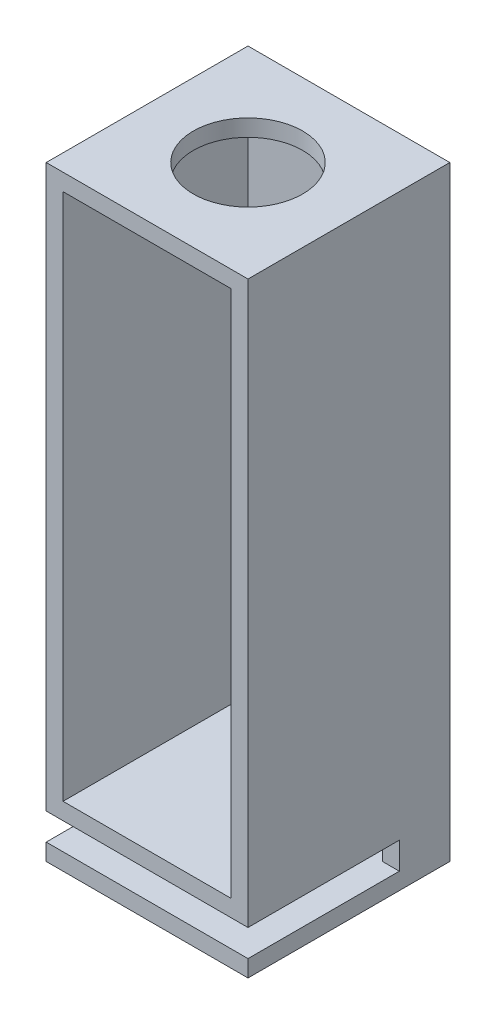
ISO-10303-21;
HEADER;
FILE_DESCRIPTION(('STEP AP214'),'2;1');
FILE_NAME('part.step','',(''),(''),'','','');
FILE_SCHEMA(('AUTOMOTIVE_DESIGN { 1 0 10303 214 1 1 1 1 }'));
ENDSEC;
DATA;
#1=APPLICATION_CONTEXT('core data for automotive mechanical design processes');
#2=APPLICATION_PROTOCOL_DEFINITION('international standard','automotive_design',2000,#1);
#3=PRODUCT_CONTEXT('',#1,'mechanical');
#4=PRODUCT('Part','Part','',(#3));
#5=PRODUCT_RELATED_PRODUCT_CATEGORY('part','',(#4));
#6=PRODUCT_DEFINITION_FORMATION('','',#4);
#7=PRODUCT_DEFINITION_CONTEXT('part definition',#1,'design');
#8=PRODUCT_DEFINITION('design','',#6,#7);
#9=PRODUCT_DEFINITION_SHAPE('','',#8);
#10=(LENGTH_UNIT() NAMED_UNIT(*) SI_UNIT(.MILLI.,.METRE.));
#11=(NAMED_UNIT(*) PLANE_ANGLE_UNIT() SI_UNIT($,.RADIAN.));
#12=(NAMED_UNIT(*) SI_UNIT($,.STERADIAN.) SOLID_ANGLE_UNIT());
#13=UNCERTAINTY_MEASURE_WITH_UNIT(LENGTH_MEASURE(1.E-05),#10,'distance_accuracy_value','');
#14=(GEOMETRIC_REPRESENTATION_CONTEXT(3) GLOBAL_UNCERTAINTY_ASSIGNED_CONTEXT((#13)) GLOBAL_UNIT_ASSIGNED_CONTEXT((#10,
#11,#12)) REPRESENTATION_CONTEXT('',''));
#15=CARTESIAN_POINT('',(0.,0.,0.));
#16=DIRECTION('',(0.,0.,1.));
#17=DIRECTION('',(1.,0.,0.));
#18=AXIS2_PLACEMENT_3D('',#15,#16,#17);
#19=CARTESIAN_POINT('',(5.,36.,-6.));
#20=DIRECTION('',(-1.,0.,0.));
#21=DIRECTION('',(0.,0.,1.));
#22=AXIS2_PLACEMENT_3D('',#19,#20,#21);
#23=PLANE('',#22);
#24=DIRECTION('',(0.,0.,1.));
#25=VECTOR('',#24,1.);
#26=CARTESIAN_POINT('',(5.,3.6,-15.0498756211209));
#27=LINE('',#26,#25);
#28=CARTESIAN_POINT('',(5.,3.6,-5.));
#29=VERTEX_POINT('',#28);
#30=CARTESIAN_POINT('',(5.,3.6,6.));
#31=VERTEX_POINT('',#30);
#32=EDGE_CURVE('E158',#29,#31,#27,.T.);
#33=ORIENTED_EDGE('',*,*,#32,.T.);
#34=DIRECTION('',(0.,-1.,0.));
#35=VECTOR('',#34,1.);
#36=CARTESIAN_POINT('',(5.,36.,6.));
#37=LINE('',#36,#35);
#38=CARTESIAN_POINT('',(5.,35.,6.));
#39=VERTEX_POINT('',#38);
#40=EDGE_CURVE('E172',#39,#31,#37,.T.);
#41=ORIENTED_EDGE('',*,*,#40,.F.);
#42=DIRECTION('',(0.,0.,-1.));
#43=VECTOR('',#42,1.);
#44=CARTESIAN_POINT('',(5.,35.,-6.));
#45=LINE('',#44,#43);
#46=CARTESIAN_POINT('',(5.,35.,-5.));
#47=VERTEX_POINT('',#46);
#48=EDGE_CURVE('E197',#39,#47,#45,.T.);
#49=ORIENTED_EDGE('',*,*,#48,.T.);
#50=DIRECTION('',(0.,-1.,0.));
#51=VECTOR('',#50,1.);
#52=CARTESIAN_POINT('',(5.,36.,-5.));
#53=LINE('',#52,#51);
#54=EDGE_CURVE('E175',#47,#29,#53,.T.);
#55=ORIENTED_EDGE('',*,*,#54,.T.);
#56=EDGE_LOOP('',(#33,#41,#49,#55));
#57=FACE_BOUND('',#56,.T.);
#58=ADVANCED_FACE('F39',(#57),#23,.T.);
#59=CARTESIAN_POINT('',(-6.,36.,-5.));
#60=DIRECTION('',(0.,0.,1.));
#61=DIRECTION('',(1.,0.,0.));
#62=AXIS2_PLACEMENT_3D('',#59,#60,#61);
#63=PLANE('',#62);
#64=DIRECTION('',(1.,0.,0.));
#65=VECTOR('',#64,1.);
#66=CARTESIAN_POINT('',(-5.,3.6,-5.));
#67=LINE('',#66,#65);
#68=CARTESIAN_POINT('',(-5.,3.6,-5.));
#69=VERTEX_POINT('',#68);
#70=EDGE_CURVE('E300',#69,#29,#67,.T.);
#71=ORIENTED_EDGE('',*,*,#70,.T.);
#72=ORIENTED_EDGE('',*,*,#54,.F.);
#73=DIRECTION('',(-1.,0.,0.));
#74=VECTOR('',#73,1.);
#75=CARTESIAN_POINT('',(-6.,35.,-5.));
#76=LINE('',#75,#74);
#77=CARTESIAN_POINT('',(-5.,35.,-5.));
#78=VERTEX_POINT('',#77);
#79=EDGE_CURVE('E277',#47,#78,#76,.T.);
#80=ORIENTED_EDGE('',*,*,#79,.T.);
#81=DIRECTION('',(0.,-1.,0.));
#82=VECTOR('',#81,1.);
#83=CARTESIAN_POINT('',(-5.,36.,-5.));
#84=LINE('',#83,#82);
#85=EDGE_CURVE('E264',#78,#69,#84,.T.);
#86=ORIENTED_EDGE('',*,*,#85,.T.);
#87=EDGE_LOOP('',(#71,#72,#80,#86));
#88=FACE_BOUND('',#87,.T.);
#89=ADVANCED_FACE('F298',(#88),#63,.T.);
#90=CARTESIAN_POINT('',(-5.,36.,-6.));
#91=DIRECTION('',(1.,0.,0.));
#92=DIRECTION('',(0.,0.,-1.));
#93=AXIS2_PLACEMENT_3D('',#90,#91,#92);
#94=PLANE('',#93);
#95=DIRECTION('',(0.,0.,1.));
#96=VECTOR('',#95,1.);
#97=CARTESIAN_POINT('',(-5.,3.6,-15.0498756211209));
#98=LINE('',#97,#96);
#99=CARTESIAN_POINT('',(-5.,3.6,6.));
#100=VERTEX_POINT('',#99);
#101=EDGE_CURVE('E161',#69,#100,#98,.T.);
#102=ORIENTED_EDGE('',*,*,#101,.F.);
#103=ORIENTED_EDGE('',*,*,#85,.F.);
#104=DIRECTION('',(0.,0.,1.));
#105=VECTOR('',#104,1.);
#106=CARTESIAN_POINT('',(-5.,35.,-6.));
#107=LINE('',#106,#105);
#108=CARTESIAN_POINT('',(-5.,35.,6.));
#109=VERTEX_POINT('',#108);
#110=EDGE_CURVE('E189',#78,#109,#107,.T.);
#111=ORIENTED_EDGE('',*,*,#110,.T.);
#112=DIRECTION('',(0.,-1.,0.));
#113=VECTOR('',#112,1.);
#114=CARTESIAN_POINT('',(-5.,36.,6.));
#115=LINE('',#114,#113);
#116=EDGE_CURVE('E183',#109,#100,#115,.T.);
#117=ORIENTED_EDGE('',*,*,#116,.T.);
#118=EDGE_LOOP('',(#102,#103,#111,#117));
#119=FACE_BOUND('',#118,.T.);
#120=ADVANCED_FACE('F371',(#119),#94,.T.);
#121=CARTESIAN_POINT('',(-6.,36.,6.));
#122=DIRECTION('',(0.,0.,-1.));
#123=DIRECTION('',(-1.,0.,0.));
#124=AXIS2_PLACEMENT_3D('',#121,#122,#123);
#125=PLANE('',#124);
#126=ORIENTED_EDGE('',*,*,#40,.T.);
#127=DIRECTION('',(-1.,0.,0.));
#128=VECTOR('',#127,1.);
#129=CARTESIAN_POINT('',(-5.,3.6,6.));
#130=LINE('',#129,#128);
#131=EDGE_CURVE('E155',#31,#100,#130,.T.);
#132=ORIENTED_EDGE('',*,*,#131,.T.);
#133=ORIENTED_EDGE('',*,*,#116,.F.);
#134=DIRECTION('',(1.,0.,0.));
#135=VECTOR('',#134,1.);
#136=CARTESIAN_POINT('',(-6.,35.,6.));
#137=LINE('',#136,#135);
#138=EDGE_CURVE('E181',#109,#39,#137,.T.);
#139=ORIENTED_EDGE('',*,*,#138,.T.);
#140=EDGE_LOOP('',(#126,#132,#133,#139));
#141=FACE_BOUND('',#140,.T.);
#142=DIRECTION('',(0.,-1.,0.));
#143=VECTOR('',#142,1.);
#144=CARTESIAN_POINT('',(-6.,36.,6.));
#145=LINE('',#144,#143);
#146=CARTESIAN_POINT('',(-6.,36.,6.));
#147=VERTEX_POINT('',#146);
#148=CARTESIAN_POINT('',(-6.,2.6,6.));
#149=VERTEX_POINT('',#148);
#150=EDGE_CURVE('E233',#147,#149,#145,.T.);
#151=ORIENTED_EDGE('',*,*,#150,.T.);
#152=DIRECTION('',(-1.,0.,0.));
#153=VECTOR('',#152,1.);
#154=CARTESIAN_POINT('',(-6.77267637178051,2.6,6.));
#155=LINE('',#154,#153);
#156=CARTESIAN_POINT('',(5.99999999999999,2.6,6.));
#157=VERTEX_POINT('',#156);
#158=EDGE_CURVE('E306',#157,#149,#155,.T.);
#159=ORIENTED_EDGE('',*,*,#158,.F.);
#160=DIRECTION('',(0.,-1.,0.));
#161=VECTOR('',#160,1.);
#162=CARTESIAN_POINT('',(6.,36.,6.));
#163=LINE('',#162,#161);
#164=CARTESIAN_POINT('',(6.,36.,6.));
#165=VERTEX_POINT('',#164);
#166=EDGE_CURVE('E228',#165,#157,#163,.T.);
#167=ORIENTED_EDGE('',*,*,#166,.F.);
#168=DIRECTION('',(1.,0.,0.));
#169=VECTOR('',#168,1.);
#170=CARTESIAN_POINT('',(-6.,36.,6.));
#171=LINE('',#170,#169);
#172=EDGE_CURVE('E210',#147,#165,#171,.T.);
#173=ORIENTED_EDGE('',*,*,#172,.F.);
#174=EDGE_LOOP('',(#151,#159,#167,#173));
#175=FACE_BOUND('',#174,.T.);
#176=ADVANCED_FACE('F179',(#141,#175),#125,.F.);
#177=CARTESIAN_POINT('',(5.99999999999999,1.,6.));
#178=VERTEX_POINT('',#177);
#179=CARTESIAN_POINT('',(6.,0.,6.));
#180=VERTEX_POINT('',#179);
#181=EDGE_CURVE('E213',#178,#180,#163,.T.);
#182=ORIENTED_EDGE('',*,*,#181,.F.);
#183=DIRECTION('',(1.,0.,0.));
#184=VECTOR('',#183,1.);
#185=CARTESIAN_POINT('',(-6.,1.,6.));
#186=LINE('',#185,#184);
#187=CARTESIAN_POINT('',(-6.,1.,6.));
#188=VERTEX_POINT('',#187);
#189=EDGE_CURVE('E194',#188,#178,#186,.T.);
#190=ORIENTED_EDGE('',*,*,#189,.F.);
#191=CARTESIAN_POINT('',(-6.,0.,6.));
#192=VERTEX_POINT('',#191);
#193=EDGE_CURVE('E232',#188,#192,#145,.T.);
#194=ORIENTED_EDGE('',*,*,#193,.T.);
#195=DIRECTION('',(1.,0.,0.));
#196=VECTOR('',#195,1.);
#197=CARTESIAN_POINT('',(-6.,0.,6.));
#198=LINE('',#197,#196);
#199=EDGE_CURVE('E204',#192,#180,#198,.T.);
#200=ORIENTED_EDGE('',*,*,#199,.T.);
#201=EDGE_LOOP('',(#182,#190,#194,#200));
#202=FACE_BOUND('',#201,.T.);
#203=ADVANCED_FACE('F254',(#202),#125,.F.);
#204=CARTESIAN_POINT('',(6.,36.,-6.));
#205=DIRECTION('',(-1.,0.,0.));
#206=DIRECTION('',(0.,0.,1.));
#207=AXIS2_PLACEMENT_3D('',#204,#205,#206);
#208=PLANE('',#207);
#209=ORIENTED_EDGE('',*,*,#166,.T.);
#210=DIRECTION('',(0.,0.,-1.));
#211=VECTOR('',#210,1.);
#212=CARTESIAN_POINT('',(6.,2.6,-6.));
#213=LINE('',#212,#211);
#214=CARTESIAN_POINT('',(5.99999999999999,2.6,-3.));
#215=VERTEX_POINT('',#214);
#216=EDGE_CURVE('E348',#157,#215,#213,.T.);
#217=ORIENTED_EDGE('',*,*,#216,.T.);
#218=DIRECTION('',(0.,-1.,0.));
#219=VECTOR('',#218,1.);
#220=CARTESIAN_POINT('',(6.,36.,-3.));
#221=LINE('',#220,#219);
#222=CARTESIAN_POINT('',(5.99999999999999,1.,-3.));
#223=VERTEX_POINT('',#222);
#224=EDGE_CURVE('E334',#215,#223,#221,.T.);
#225=ORIENTED_EDGE('',*,*,#224,.T.);
#226=DIRECTION('',(0.,0.,1.));
#227=VECTOR('',#226,1.);
#228=CARTESIAN_POINT('',(6.,1.,-6.));
#229=LINE('',#228,#227);
#230=EDGE_CURVE('E341',#223,#178,#229,.T.);
#231=ORIENTED_EDGE('',*,*,#230,.T.);
#232=ORIENTED_EDGE('',*,*,#181,.T.);
#233=DIRECTION('',(0.,0.,-1.));
#234=VECTOR('',#233,1.);
#235=CARTESIAN_POINT('',(6.,0.,-6.));
#236=LINE('',#235,#234);
#237=CARTESIAN_POINT('',(6.,0.,-6.));
#238=VERTEX_POINT('',#237);
#239=EDGE_CURVE('E214',#180,#238,#236,.T.);
#240=ORIENTED_EDGE('',*,*,#239,.T.);
#241=DIRECTION('',(0.,-1.,0.));
#242=VECTOR('',#241,1.);
#243=CARTESIAN_POINT('',(6.,36.,-6.));
#244=LINE('',#243,#242);
#245=CARTESIAN_POINT('',(6.,36.,-6.));
#246=VERTEX_POINT('',#245);
#247=EDGE_CURVE('E11',#246,#238,#244,.T.);
#248=ORIENTED_EDGE('',*,*,#247,.F.);
#249=DIRECTION('',(0.,0.,-1.));
#250=VECTOR('',#249,1.);
#251=CARTESIAN_POINT('',(6.,36.,-6.));
#252=LINE('',#251,#250);
#253=EDGE_CURVE('E199',#165,#246,#252,.T.);
#254=ORIENTED_EDGE('',*,*,#253,.F.);
#255=EDGE_LOOP('',(#209,#217,#225,#231,#232,#240,#248,#254));
#256=FACE_BOUND('',#255,.T.);
#257=ADVANCED_FACE('F41',(#256),#208,.F.);
#258=CARTESIAN_POINT('',(-6.,36.,-6.));
#259=DIRECTION('',(0.,0.,1.));
#260=DIRECTION('',(1.,0.,0.));
#261=AXIS2_PLACEMENT_3D('',#258,#259,#260);
#262=PLANE('',#261);
#263=DIRECTION('',(-1.,0.,0.));
#264=VECTOR('',#263,1.);
#265=CARTESIAN_POINT('',(-6.,0.,-6.));
#266=LINE('',#265,#264);
#267=CARTESIAN_POINT('',(-6.,0.,-6.));
#268=VERTEX_POINT('',#267);
#269=EDGE_CURVE('E218',#238,#268,#266,.T.);
#270=ORIENTED_EDGE('',*,*,#269,.T.);
#271=DIRECTION('',(0.,-1.,0.));
#272=VECTOR('',#271,1.);
#273=CARTESIAN_POINT('',(-6.,36.,-6.));
#274=LINE('',#273,#272);
#275=CARTESIAN_POINT('',(-6.,36.,-6.));
#276=VERTEX_POINT('',#275);
#277=EDGE_CURVE('E49',#276,#268,#274,.T.);
#278=ORIENTED_EDGE('',*,*,#277,.F.);
#279=DIRECTION('',(-1.,0.,0.));
#280=VECTOR('',#279,1.);
#281=CARTESIAN_POINT('',(-6.,36.,-6.));
#282=LINE('',#281,#280);
#283=EDGE_CURVE('E203',#246,#276,#282,.T.);
#284=ORIENTED_EDGE('',*,*,#283,.F.);
#285=ORIENTED_EDGE('',*,*,#247,.T.);
#286=EDGE_LOOP('',(#270,#278,#284,#285));
#287=FACE_BOUND('',#286,.T.);
#288=ADVANCED_FACE('F399',(#287),#262,.F.);
#289=CARTESIAN_POINT('',(-6.,36.,-6.));
#290=DIRECTION('',(1.,0.,0.));
#291=DIRECTION('',(0.,0.,-1.));
#292=AXIS2_PLACEMENT_3D('',#289,#290,#291);
#293=PLANE('',#292);
#294=DIRECTION('',(0.,1.,0.));
#295=VECTOR('',#294,1.);
#296=CARTESIAN_POINT('',(-6.,36.,-3.));
#297=LINE('',#296,#295);
#298=CARTESIAN_POINT('',(-6.,1.,-3.));
#299=VERTEX_POINT('',#298);
#300=CARTESIAN_POINT('',(-6.,2.6,-3.));
#301=VERTEX_POINT('',#300);
#302=EDGE_CURVE('E331',#299,#301,#297,.T.);
#303=ORIENTED_EDGE('',*,*,#302,.T.);
#304=DIRECTION('',(0.,0.,1.));
#305=VECTOR('',#304,1.);
#306=CARTESIAN_POINT('',(-6.,2.6,-6.));
#307=LINE('',#306,#305);
#308=EDGE_CURVE('E345',#301,#149,#307,.T.);
#309=ORIENTED_EDGE('',*,*,#308,.T.);
#310=ORIENTED_EDGE('',*,*,#150,.F.);
#311=DIRECTION('',(0.,0.,1.));
#312=VECTOR('',#311,1.);
#313=CARTESIAN_POINT('',(-6.,36.,-6.));
#314=LINE('',#313,#312);
#315=EDGE_CURVE('E207',#276,#147,#314,.T.);
#316=ORIENTED_EDGE('',*,*,#315,.F.);
#317=ORIENTED_EDGE('',*,*,#277,.T.);
#318=DIRECTION('',(0.,0.,1.));
#319=VECTOR('',#318,1.);
#320=CARTESIAN_POINT('',(-6.,0.,-6.));
#321=LINE('',#320,#319);
#322=EDGE_CURVE('E221',#268,#192,#321,.T.);
#323=ORIENTED_EDGE('',*,*,#322,.T.);
#324=ORIENTED_EDGE('',*,*,#193,.F.);
#325=DIRECTION('',(0.,0.,-1.));
#326=VECTOR('',#325,1.);
#327=CARTESIAN_POINT('',(-6.,1.,-6.));
#328=LINE('',#327,#326);
#329=EDGE_CURVE('E338',#188,#299,#328,.T.);
#330=ORIENTED_EDGE('',*,*,#329,.T.);
#331=EDGE_LOOP('',(#303,#309,#310,#316,#317,#323,#324,#330));
#332=FACE_BOUND('',#331,.T.);
#333=ADVANCED_FACE('F244',(#332),#293,.F.);
#334=CARTESIAN_POINT('',(0.,36.,0.));
#335=DIRECTION('',(0.,1.,0.));
#336=DIRECTION('',(0.,0.,1.));
#337=AXIS2_PLACEMENT_3D('',#334,#335,#336);
#338=PLANE('',#337);
#339=CARTESIAN_POINT('',(0.,36.,0.));
#340=DIRECTION('',(0.,1.,0.));
#341=DIRECTION('',(0.,0.,1.));
#342=AXIS2_PLACEMENT_3D('',#339,#340,#341);
#343=CIRCLE('',#342,3.25);
#344=CARTESIAN_POINT('',(0.,36.,-3.25));
#345=VERTEX_POINT('',#344);
#346=EDGE_CURVE('E287',#345,#345,#343,.F.);
#347=ORIENTED_EDGE('',*,*,#346,.T.);
#348=EDGE_LOOP('',(#347));
#349=FACE_BOUND('',#348,.T.);
#350=ORIENTED_EDGE('',*,*,#253,.T.);
#351=ORIENTED_EDGE('',*,*,#283,.T.);
#352=ORIENTED_EDGE('',*,*,#315,.T.);
#353=ORIENTED_EDGE('',*,*,#172,.T.);
#354=EDGE_LOOP('',(#350,#351,#352,#353));
#355=FACE_BOUND('',#354,.T.);
#356=ADVANCED_FACE('F386',(#349,#355),#338,.T.);
#357=CARTESIAN_POINT('',(0.,0.,0.));
#358=DIRECTION('',(0.,1.,0.));
#359=DIRECTION('',(0.,0.,1.));
#360=AXIS2_PLACEMENT_3D('',#357,#358,#359);
#361=PLANE('',#360);
#362=ORIENTED_EDGE('',*,*,#239,.F.);
#363=ORIENTED_EDGE('',*,*,#199,.F.);
#364=ORIENTED_EDGE('',*,*,#322,.F.);
#365=ORIENTED_EDGE('',*,*,#269,.F.);
#366=EDGE_LOOP('',(#362,#363,#364,#365));
#367=FACE_BOUND('',#366,.T.);
#368=ADVANCED_FACE('F251',(#367),#361,.F.);
#369=DIRECTION('',(0.,0.,1.));
#370=VECTOR('',#369,1.);
#371=CARTESIAN_POINT('',(5.,2.6,-15.0498756211209));
#372=LINE('',#371,#370);
#373=CARTESIAN_POINT('',(5.,2.6,-5.));
#374=VERTEX_POINT('',#373);
#375=CARTESIAN_POINT('',(5.,2.6,-3.));
#376=VERTEX_POINT('',#375);
#377=EDGE_CURVE('E56',#374,#376,#372,.T.);
#378=ORIENTED_EDGE('',*,*,#377,.F.);
#379=CARTESIAN_POINT('',(5.,1.,-5.));
#380=VERTEX_POINT('',#379);
#381=EDGE_CURVE('E261',#374,#380,#53,.T.);
#382=ORIENTED_EDGE('',*,*,#381,.T.);
#383=DIRECTION('',(0.,0.,-1.));
#384=VECTOR('',#383,1.);
#385=CARTESIAN_POINT('',(5.,1.,-6.));
#386=LINE('',#385,#384);
#387=CARTESIAN_POINT('',(5.,1.,-3.));
#388=VERTEX_POINT('',#387);
#389=EDGE_CURVE('E284',#388,#380,#386,.T.);
#390=ORIENTED_EDGE('',*,*,#389,.F.);
#391=DIRECTION('',(0.,-1.,0.));
#392=VECTOR('',#391,1.);
#393=CARTESIAN_POINT('',(5.,36.,-3.));
#394=LINE('',#393,#392);
#395=EDGE_CURVE('E328',#376,#388,#394,.T.);
#396=ORIENTED_EDGE('',*,*,#395,.F.);
#397=EDGE_LOOP('',(#378,#382,#390,#396));
#398=FACE_BOUND('',#397,.T.);
#399=ADVANCED_FACE('F374',(#398),#23,.T.);
#400=DIRECTION('',(-1.,0.,0.));
#401=VECTOR('',#400,1.);
#402=CARTESIAN_POINT('',(-5.,2.6,-5.));
#403=LINE('',#402,#401);
#404=CARTESIAN_POINT('',(-5.,2.6,-5.));
#405=VERTEX_POINT('',#404);
#406=EDGE_CURVE('E302',#374,#405,#403,.T.);
#407=ORIENTED_EDGE('',*,*,#406,.T.);
#408=CARTESIAN_POINT('',(-5.,1.,-5.));
#409=VERTEX_POINT('',#408);
#410=EDGE_CURVE('E187',#405,#409,#84,.T.);
#411=ORIENTED_EDGE('',*,*,#410,.T.);
#412=DIRECTION('',(-1.,0.,0.));
#413=VECTOR('',#412,1.);
#414=CARTESIAN_POINT('',(-6.,1.,-5.));
#415=LINE('',#414,#413);
#416=EDGE_CURVE('E275',#380,#409,#415,.T.);
#417=ORIENTED_EDGE('',*,*,#416,.F.);
#418=ORIENTED_EDGE('',*,*,#381,.F.);
#419=EDGE_LOOP('',(#407,#411,#417,#418));
#420=FACE_BOUND('',#419,.T.);
#421=ADVANCED_FACE('F368',(#420),#63,.T.);
#422=DIRECTION('',(0.,0.,1.));
#423=VECTOR('',#422,1.);
#424=CARTESIAN_POINT('',(-5.,2.6,-15.0498756211209));
#425=LINE('',#424,#423);
#426=CARTESIAN_POINT('',(-5.,2.6,-3.));
#427=VERTEX_POINT('',#426);
#428=EDGE_CURVE('E167',#405,#427,#425,.T.);
#429=ORIENTED_EDGE('',*,*,#428,.T.);
#430=DIRECTION('',(0.,1.,0.));
#431=VECTOR('',#430,1.);
#432=CARTESIAN_POINT('',(-5.,36.,-3.));
#433=LINE('',#432,#431);
#434=CARTESIAN_POINT('',(-5.,1.,-3.));
#435=VERTEX_POINT('',#434);
#436=EDGE_CURVE('E325',#435,#427,#433,.T.);
#437=ORIENTED_EDGE('',*,*,#436,.F.);
#438=DIRECTION('',(0.,0.,1.));
#439=VECTOR('',#438,1.);
#440=CARTESIAN_POINT('',(-5.,1.,-6.));
#441=LINE('',#440,#439);
#442=EDGE_CURVE('E198',#409,#435,#441,.T.);
#443=ORIENTED_EDGE('',*,*,#442,.F.);
#444=ORIENTED_EDGE('',*,*,#410,.F.);
#445=EDGE_LOOP('',(#429,#437,#443,#444));
#446=FACE_BOUND('',#445,.T.);
#447=ADVANCED_FACE('F361',(#446),#94,.T.);
#448=CARTESIAN_POINT('',(0.,35.,0.));
#449=DIRECTION('',(0.,1.,0.));
#450=DIRECTION('',(0.,0.,1.));
#451=AXIS2_PLACEMENT_3D('',#448,#449,#450);
#452=PLANE('',#451);
#453=CARTESIAN_POINT('',(0.,35.,0.));
#454=DIRECTION('',(0.,1.,0.));
#455=DIRECTION('',(0.,0.,1.));
#456=AXIS2_PLACEMENT_3D('',#453,#454,#455);
#457=CIRCLE('',#456,3.25);
#458=CARTESIAN_POINT('',(0.,35.,-3.25));
#459=VERTEX_POINT('',#458);
#460=EDGE_CURVE('E43',#459,#459,#457,.F.);
#461=ORIENTED_EDGE('',*,*,#460,.F.);
#462=EDGE_LOOP('',(#461));
#463=FACE_BOUND('',#462,.T.);
#464=ORIENTED_EDGE('',*,*,#48,.F.);
#465=ORIENTED_EDGE('',*,*,#138,.F.);
#466=ORIENTED_EDGE('',*,*,#110,.F.);
#467=ORIENTED_EDGE('',*,*,#79,.F.);
#468=EDGE_LOOP('',(#464,#465,#466,#467));
#469=FACE_BOUND('',#468,.T.);
#470=ADVANCED_FACE('F358',(#463,#469),#452,.F.);
#471=CARTESIAN_POINT('',(0.,1.,0.));
#472=DIRECTION('',(0.,1.,0.));
#473=DIRECTION('',(0.,0.,1.));
#474=AXIS2_PLACEMENT_3D('',#471,#472,#473);
#475=PLANE('',#474);
#476=ORIENTED_EDGE('',*,*,#442,.T.);
#477=DIRECTION('',(1.,0.,0.));
#478=VECTOR('',#477,1.);
#479=CARTESIAN_POINT('',(-6.77267637178051,1.,-3.));
#480=LINE('',#479,#478);
#481=EDGE_CURVE('E64',#299,#435,#480,.T.);
#482=ORIENTED_EDGE('',*,*,#481,.F.);
#483=ORIENTED_EDGE('',*,*,#329,.F.);
#484=ORIENTED_EDGE('',*,*,#189,.T.);
#485=ORIENTED_EDGE('',*,*,#230,.F.);
#486=EDGE_CURVE('E314',#388,#223,#480,.T.);
#487=ORIENTED_EDGE('',*,*,#486,.F.);
#488=ORIENTED_EDGE('',*,*,#389,.T.);
#489=ORIENTED_EDGE('',*,*,#416,.T.);
#490=EDGE_LOOP('',(#476,#482,#483,#484,#485,#487,#488,#489));
#491=FACE_BOUND('',#490,.T.);
#492=ADVANCED_FACE('F360',(#491),#475,.T.);
#493=CARTESIAN_POINT('',(0.,36.000012,0.));
#494=DIRECTION('',(0.,-1.,0.));
#495=DIRECTION('',(0.,0.,-1.));
#496=AXIS2_PLACEMENT_3D('',#493,#494,#495);
#497=CYLINDRICAL_SURFACE('',#496,3.25);
#498=CARTESIAN_POINT('',(0.,36.,-3.25));
#499=CARTESIAN_POINT('',(0.,35.9895833333333,-3.25));
#500=CARTESIAN_POINT('',(0.,35.9791666666667,-3.25));
#501=CARTESIAN_POINT('',(0.,35.9583333333333,-3.25));
#502=CARTESIAN_POINT('',(0.,35.9479166666667,-3.25));
#503=CARTESIAN_POINT('',(0.,35.9270833333333,-3.25));
#504=CARTESIAN_POINT('',(0.,35.9166666666667,-3.25));
#505=CARTESIAN_POINT('',(0.,35.8958333333333,-3.25));
#506=CARTESIAN_POINT('',(0.,35.8854166666667,-3.25));
#507=CARTESIAN_POINT('',(0.,35.8645833333333,-3.25));
#508=CARTESIAN_POINT('',(0.,35.8541666666667,-3.25));
#509=CARTESIAN_POINT('',(0.,35.8333333333333,-3.25));
#510=CARTESIAN_POINT('',(0.,35.8229166666667,-3.25));
#511=CARTESIAN_POINT('',(0.,35.8020833333333,-3.25));
#512=CARTESIAN_POINT('',(0.,35.7916666666667,-3.25));
#513=CARTESIAN_POINT('',(0.,35.7708333333333,-3.25));
#514=CARTESIAN_POINT('',(0.,35.7604166666667,-3.25));
#515=CARTESIAN_POINT('',(0.,35.7395833333333,-3.25));
#516=CARTESIAN_POINT('',(0.,35.7291666666667,-3.25));
#517=CARTESIAN_POINT('',(0.,35.7083333333333,-3.25));
#518=CARTESIAN_POINT('',(0.,35.6979166666667,-3.25));
#519=CARTESIAN_POINT('',(0.,35.6770833333333,-3.25));
#520=CARTESIAN_POINT('',(0.,35.6666666666667,-3.25));
#521=CARTESIAN_POINT('',(0.,35.6458333333333,-3.25));
#522=CARTESIAN_POINT('',(0.,35.6354166666667,-3.25));
#523=CARTESIAN_POINT('',(0.,35.6145833333333,-3.25));
#524=CARTESIAN_POINT('',(0.,35.6041666666667,-3.25));
#525=CARTESIAN_POINT('',(0.,35.5833333333333,-3.25));
#526=CARTESIAN_POINT('',(0.,35.5729166666667,-3.25));
#527=CARTESIAN_POINT('',(0.,35.5520833333333,-3.25));
#528=CARTESIAN_POINT('',(0.,35.5416666666667,-3.25));
#529=CARTESIAN_POINT('',(0.,35.5208333333333,-3.25));
#530=CARTESIAN_POINT('',(0.,35.5104166666667,-3.25));
#531=CARTESIAN_POINT('',(0.,35.4895833333333,-3.25));
#532=CARTESIAN_POINT('',(0.,35.4791666666667,-3.25));
#533=CARTESIAN_POINT('',(0.,35.4583333333333,-3.25));
#534=CARTESIAN_POINT('',(0.,35.4479166666667,-3.25));
#535=CARTESIAN_POINT('',(0.,35.4270833333333,-3.25));
#536=CARTESIAN_POINT('',(0.,35.4166666666667,-3.25));
#537=CARTESIAN_POINT('',(0.,35.3958333333333,-3.25));
#538=CARTESIAN_POINT('',(0.,35.3854166666667,-3.25));
#539=CARTESIAN_POINT('',(0.,35.3645833333333,-3.25));
#540=CARTESIAN_POINT('',(0.,35.3541666666667,-3.25));
#541=CARTESIAN_POINT('',(0.,35.3333333333333,-3.25));
#542=CARTESIAN_POINT('',(0.,35.3229166666667,-3.25));
#543=CARTESIAN_POINT('',(0.,35.3020833333333,-3.25));
#544=CARTESIAN_POINT('',(0.,35.2916666666667,-3.25));
#545=CARTESIAN_POINT('',(0.,35.2708333333333,-3.25));
#546=CARTESIAN_POINT('',(0.,35.2604166666667,-3.25));
#547=CARTESIAN_POINT('',(0.,35.2395833333333,-3.25));
#548=CARTESIAN_POINT('',(0.,35.2291666666667,-3.25));
#549=CARTESIAN_POINT('',(0.,35.2083333333333,-3.25));
#550=CARTESIAN_POINT('',(0.,35.1979166666667,-3.25));
#551=CARTESIAN_POINT('',(0.,35.1770833333333,-3.25));
#552=CARTESIAN_POINT('',(0.,35.1666666666667,-3.25));
#553=CARTESIAN_POINT('',(0.,35.1458333333333,-3.25));
#554=CARTESIAN_POINT('',(0.,35.1354166666667,-3.25));
#555=CARTESIAN_POINT('',(0.,35.1145833333333,-3.25));
#556=CARTESIAN_POINT('',(0.,35.1041666666667,-3.25));
#557=CARTESIAN_POINT('',(0.,35.0833333333333,-3.25));
#558=CARTESIAN_POINT('',(0.,35.0729166666667,-3.25));
#559=CARTESIAN_POINT('',(0.,35.0520833333333,-3.25));
#560=CARTESIAN_POINT('',(0.,35.0416666666667,-3.25));
#561=CARTESIAN_POINT('',(0.,35.0208333333333,-3.25));
#562=CARTESIAN_POINT('',(0.,35.0104166666667,-3.25));
#563=CARTESIAN_POINT('',(0.,35.,-3.25));
#564=B_SPLINE_CURVE_WITH_KNOTS('',3,(#498,#499,#500,#501,#502,#503,#504,#505,#506,#507,#508,
#509,#510,#511,#512,#513,#514,#515,#516,#517,#518,#519,#520,#521,#522,#523,#524,#525,#526,#527,
#528,#529,#530,#531,#532,#533,#534,#535,#536,#537,#538,#539,#540,#541,#542,#543,#544,#545,#546,
#547,#548,#549,#550,#551,#552,#553,#554,#555,#556,#557,#558,#559,#560,#561,#562,#563),
.UNSPECIFIED.,.F.,.F.,(4,2,2,2,2,2,2,2,2,2,2,2,2,2,2,2,2,2,2,2,2,2,2,2,2,2,2,2,2,2,2,2,4),(0.,
0.0312500000000035,0.0625000000000001,0.0937500000000036,0.125,0.156250000000004,0.1875,
0.218750000000004,0.25,0.281250000000004,0.3125,0.343750000000004,0.375,0.406250000000004,
0.4375,0.468750000000004,0.5,0.531250000000004,0.5625,0.593750000000004,0.625000000000001,
0.656250000000004,0.687500000000001,0.718750000000004,0.750000000000001,0.781250000000004,
0.812500000000001,0.843750000000004,0.875000000000001,0.906250000000004,0.937500000000001,
0.968750000000004,1.),.UNSPECIFIED.);
#565=EDGE_CURVE('BSEAM356',#345,#459,#564,.T.);
#566=ORIENTED_EDGE('',*,*,#346,.F.);
#567=ORIENTED_EDGE('',*,*,#460,.T.);
#568=ORIENTED_EDGE('',*,*,#565,.T.);
#569=ORIENTED_EDGE('',*,*,#565,.F.);
#570=EDGE_LOOP('',(#566,#568,#567,#569));
#571=FACE_BOUND('',#570,.T.);
#572=ADVANCED_FACE('F356',(#571),#497,.F.);
#573=CARTESIAN_POINT('',(0.,0.,-3.));
#574=DIRECTION('',(0.,0.,-1.));
#575=DIRECTION('',(-1.,0.,0.));
#576=AXIS2_PLACEMENT_3D('',#573,#574,#575);
#577=PLANE('',#576);
#578=ORIENTED_EDGE('',*,*,#481,.T.);
#579=ORIENTED_EDGE('',*,*,#436,.T.);
#580=DIRECTION('',(-1.,0.,0.));
#581=VECTOR('',#580,1.);
#582=CARTESIAN_POINT('',(-6.77267637178051,2.6,-3.));
#583=LINE('',#582,#581);
#584=EDGE_CURVE('E318',#427,#301,#583,.T.);
#585=ORIENTED_EDGE('',*,*,#584,.T.);
#586=ORIENTED_EDGE('',*,*,#302,.F.);
#587=EDGE_LOOP('',(#578,#579,#585,#586));
#588=FACE_BOUND('',#587,.T.);
#589=ADVANCED_FACE('F391',(#588),#577,.F.);
#590=CARTESIAN_POINT('',(-6.77267637178051,2.6,-3.));
#591=DIRECTION('',(0.,1.,0.));
#592=DIRECTION('',(0.,0.,1.));
#593=AXIS2_PLACEMENT_3D('',#590,#591,#592);
#594=PLANE('',#593);
#595=ORIENTED_EDGE('',*,*,#158,.T.);
#596=ORIENTED_EDGE('',*,*,#308,.F.);
#597=ORIENTED_EDGE('',*,*,#584,.F.);
#598=ORIENTED_EDGE('',*,*,#428,.F.);
#599=ORIENTED_EDGE('',*,*,#406,.F.);
#600=ORIENTED_EDGE('',*,*,#377,.T.);
#601=EDGE_CURVE('E322',#215,#376,#583,.T.);
#602=ORIENTED_EDGE('',*,*,#601,.F.);
#603=ORIENTED_EDGE('',*,*,#216,.F.);
#604=EDGE_LOOP('',(#595,#596,#597,#598,#599,#600,#602,#603));
#605=FACE_BOUND('',#604,.T.);
#606=ADVANCED_FACE('F392',(#605),#594,.F.);
#607=ORIENTED_EDGE('',*,*,#601,.T.);
#608=ORIENTED_EDGE('',*,*,#395,.T.);
#609=ORIENTED_EDGE('',*,*,#486,.T.);
#610=ORIENTED_EDGE('',*,*,#224,.F.);
#611=EDGE_LOOP('',(#607,#608,#609,#610));
#612=FACE_BOUND('',#611,.T.);
#613=ADVANCED_FACE('F401',(#612),#577,.F.);
#614=CARTESIAN_POINT('',(-5.,3.6,-15.0498756211209));
#615=DIRECTION('',(0.,1.,0.));
#616=DIRECTION('',(0.,0.,1.));
#617=AXIS2_PLACEMENT_3D('',#614,#615,#616);
#618=PLANE('',#617);
#619=ORIENTED_EDGE('',*,*,#70,.F.);
#620=ORIENTED_EDGE('',*,*,#101,.T.);
#621=ORIENTED_EDGE('',*,*,#131,.F.);
#622=ORIENTED_EDGE('',*,*,#32,.F.);
#623=EDGE_LOOP('',(#619,#620,#621,#622));
#624=FACE_BOUND('',#623,.T.);
#625=ADVANCED_FACE('F157',(#624),#618,.T.);
#626=CLOSED_SHELL('',(#58,#89,#120,#176,#203,#257,#288,#333,#356,#368,#399,#421,#447,#470,#492,
#572,#589,#606,#613,#625));
#627=MANIFOLD_SOLID_BREP('B2',#626);
#628=ADVANCED_BREP_SHAPE_REPRESENTATION('',(#18,#627),#14);
#629=SHAPE_DEFINITION_REPRESENTATION(#9,#628);
ENDSEC;
END-ISO-10303-21;
